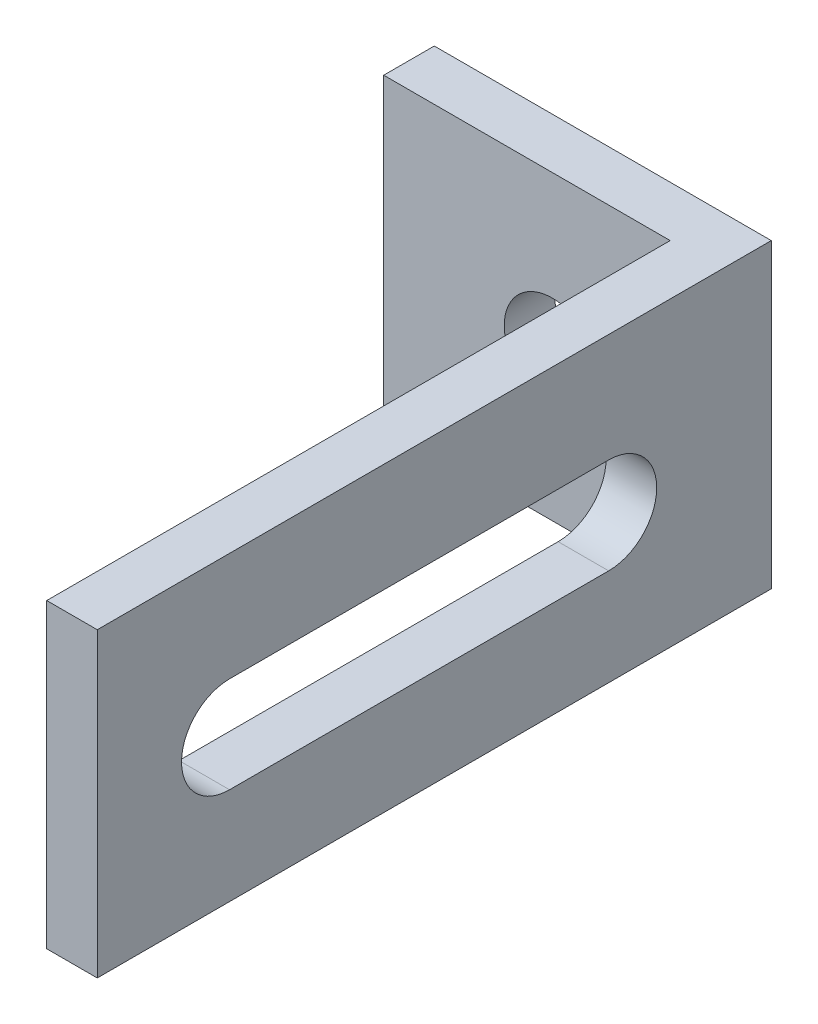
ISO-10303-21;
HEADER;
FILE_DESCRIPTION(('STEP AP214'),'2;1');
FILE_NAME('part.step','',(''),(''),'','','');
FILE_SCHEMA(('AUTOMOTIVE_DESIGN { 1 0 10303 214 1 1 1 1 }'));
ENDSEC;
DATA;
#1=APPLICATION_CONTEXT('core data for automotive mechanical design processes');
#2=APPLICATION_PROTOCOL_DEFINITION('international standard','automotive_design',2000,#1);
#3=PRODUCT_CONTEXT('',#1,'mechanical');
#4=PRODUCT('Part','Part','',(#3));
#5=PRODUCT_RELATED_PRODUCT_CATEGORY('part','',(#4));
#6=PRODUCT_DEFINITION_FORMATION('','',#4);
#7=PRODUCT_DEFINITION_CONTEXT('part definition',#1,'design');
#8=PRODUCT_DEFINITION('design','',#6,#7);
#9=PRODUCT_DEFINITION_SHAPE('','',#8);
#10=(LENGTH_UNIT() NAMED_UNIT(*) SI_UNIT(.MILLI.,.METRE.));
#11=(NAMED_UNIT(*) PLANE_ANGLE_UNIT() SI_UNIT($,.RADIAN.));
#12=(NAMED_UNIT(*) SI_UNIT($,.STERADIAN.) SOLID_ANGLE_UNIT());
#13=UNCERTAINTY_MEASURE_WITH_UNIT(LENGTH_MEASURE(1.E-05),#10,'distance_accuracy_value','');
#14=(GEOMETRIC_REPRESENTATION_CONTEXT(3) GLOBAL_UNCERTAINTY_ASSIGNED_CONTEXT((#13)) GLOBAL_UNIT_ASSIGNED_CONTEXT((#10,
#11,#12)) REPRESENTATION_CONTEXT('',''));
#15=CARTESIAN_POINT('',(0.,0.,0.));
#16=DIRECTION('',(0.,0.,1.));
#17=DIRECTION('',(1.,0.,0.));
#18=AXIS2_PLACEMENT_3D('',#15,#16,#17);
#19=CARTESIAN_POINT('',(0.,0.,3.));
#20=DIRECTION('',(0.,0.,-1.));
#21=DIRECTION('',(-1.,0.,0.));
#22=AXIS2_PLACEMENT_3D('',#19,#20,#21);
#23=PLANE('',#22);
#24=CARTESIAN_POINT('',(0.,-0.349999999999998,3.));
#25=DIRECTION('',(0.,0.,1.));
#26=DIRECTION('',(1.,0.,0.));
#27=AXIS2_PLACEMENT_3D('',#24,#25,#26);
#28=CIRCLE('',#27,2.85);
#29=CARTESIAN_POINT('',(2.85,-0.349999999999998,3.));
#30=VERTEX_POINT('',#29);
#31=EDGE_CURVE('E175',#30,#30,#28,.T.);
#32=ORIENTED_EDGE('',*,*,#31,.F.);
#33=EDGE_LOOP('',(#32));
#34=FACE_BOUND('',#33,.T.);
#35=DIRECTION('',(0.,-1.,0.));
#36=VECTOR('',#35,1.);
#37=CARTESIAN_POINT('',(7.,8.95,3.));
#38=LINE('',#37,#36);
#39=CARTESIAN_POINT('',(7.,8.95,3.));
#40=VERTEX_POINT('',#39);
#41=CARTESIAN_POINT('',(7.,-8.95,3.));
#42=VERTEX_POINT('',#41);
#43=EDGE_CURVE('E155',#40,#42,#38,.T.);
#44=ORIENTED_EDGE('',*,*,#43,.F.);
#45=DIRECTION('',(-1.,0.,0.));
#46=VECTOR('',#45,1.);
#47=CARTESIAN_POINT('',(-10.,8.95,3.));
#48=LINE('',#47,#46);
#49=CARTESIAN_POINT('',(-10.,8.95,3.));
#50=VERTEX_POINT('',#49);
#51=EDGE_CURVE('E181',#40,#50,#48,.T.);
#52=ORIENTED_EDGE('',*,*,#51,.T.);
#53=DIRECTION('',(0.,-1.,0.));
#54=VECTOR('',#53,1.);
#55=CARTESIAN_POINT('',(-10.,-8.95,3.));
#56=LINE('',#55,#54);
#57=CARTESIAN_POINT('',(-10.,-8.95,3.));
#58=VERTEX_POINT('',#57);
#59=EDGE_CURVE('E183',#50,#58,#56,.T.);
#60=ORIENTED_EDGE('',*,*,#59,.T.);
#61=DIRECTION('',(1.,0.,0.));
#62=VECTOR('',#61,1.);
#63=CARTESIAN_POINT('',(-10.,-8.95,3.));
#64=LINE('',#63,#62);
#65=EDGE_CURVE('E186',#58,#42,#64,.T.);
#66=ORIENTED_EDGE('',*,*,#65,.T.);
#67=EDGE_LOOP('',(#44,#52,#60,#66));
#68=FACE_BOUND('',#67,.T.);
#69=ADVANCED_FACE('F41',(#34,#68),#23,.F.);
#70=CARTESIAN_POINT('',(0.,0.,0.));
#71=DIRECTION('',(0.,0.,-1.));
#72=DIRECTION('',(-1.,0.,0.));
#73=AXIS2_PLACEMENT_3D('',#70,#71,#72);
#74=PLANE('',#73);
#75=DIRECTION('',(0.,1.,0.));
#76=VECTOR('',#75,1.);
#77=CARTESIAN_POINT('',(10.,-8.95,0.));
#78=LINE('',#77,#76);
#79=CARTESIAN_POINT('',(10.,-8.95,0.));
#80=VERTEX_POINT('',#79);
#81=CARTESIAN_POINT('',(10.,8.95,0.));
#82=VERTEX_POINT('',#81);
#83=EDGE_CURVE('E178',#80,#82,#78,.T.);
#84=ORIENTED_EDGE('',*,*,#83,.F.);
#85=DIRECTION('',(1.,0.,0.));
#86=VECTOR('',#85,1.);
#87=CARTESIAN_POINT('',(-10.,-8.95,0.));
#88=LINE('',#87,#86);
#89=CARTESIAN_POINT('',(-10.,-8.95,0.));
#90=VERTEX_POINT('',#89);
#91=EDGE_CURVE('E184',#90,#80,#88,.T.);
#92=ORIENTED_EDGE('',*,*,#91,.F.);
#93=DIRECTION('',(0.,-1.,0.));
#94=VECTOR('',#93,1.);
#95=CARTESIAN_POINT('',(-10.,-8.95,0.));
#96=LINE('',#95,#94);
#97=CARTESIAN_POINT('',(-10.,8.95,0.));
#98=VERTEX_POINT('',#97);
#99=EDGE_CURVE('E193',#98,#90,#96,.T.);
#100=ORIENTED_EDGE('',*,*,#99,.F.);
#101=DIRECTION('',(-1.,0.,0.));
#102=VECTOR('',#101,1.);
#103=CARTESIAN_POINT('',(-10.,8.95,0.));
#104=LINE('',#103,#102);
#105=EDGE_CURVE('E191',#82,#98,#104,.T.);
#106=ORIENTED_EDGE('',*,*,#105,.F.);
#107=EDGE_LOOP('',(#84,#92,#100,#106));
#108=FACE_BOUND('',#107,.T.);
#109=CARTESIAN_POINT('',(0.,-0.349999999999998,0.));
#110=DIRECTION('',(0.,0.,1.));
#111=DIRECTION('',(1.,0.,0.));
#112=AXIS2_PLACEMENT_3D('',#109,#110,#111);
#113=CIRCLE('',#112,2.85);
#114=CARTESIAN_POINT('',(2.85,-0.349999999999998,0.));
#115=VERTEX_POINT('',#114);
#116=EDGE_CURVE('E174',#115,#115,#113,.T.);
#117=ORIENTED_EDGE('',*,*,#116,.T.);
#118=EDGE_LOOP('',(#117));
#119=FACE_BOUND('',#118,.T.);
#120=ADVANCED_FACE('F212',(#108,#119),#74,.T.);
#121=CARTESIAN_POINT('',(10.,-8.95,3.));
#122=DIRECTION('',(-1.,0.,0.));
#123=DIRECTION('',(0.,0.,1.));
#124=AXIS2_PLACEMENT_3D('',#121,#122,#123);
#125=PLANE('',#124);
#126=DIRECTION('',(0.,0.,1.));
#127=VECTOR('',#126,1.);
#128=CARTESIAN_POINT('',(10.,-3.2,3.));
#129=LINE('',#128,#127);
#130=CARTESIAN_POINT('',(10.,-3.2,9.65));
#131=VERTEX_POINT('',#130);
#132=CARTESIAN_POINT('',(10.,-3.2,32.15));
#133=VERTEX_POINT('',#132);
#134=EDGE_CURVE('E149',#131,#133,#129,.T.);
#135=ORIENTED_EDGE('',*,*,#134,.T.);
#136=CARTESIAN_POINT('',(10.,-0.349999999999999,32.15));
#137=DIRECTION('',(-1.,0.,0.));
#138=DIRECTION('',(0.,0.,1.));
#139=AXIS2_PLACEMENT_3D('',#136,#137,#138);
#140=CIRCLE('',#139,2.85);
#141=CARTESIAN_POINT('',(10.,2.5,32.15));
#142=VERTEX_POINT('',#141);
#143=EDGE_CURVE('E152',#133,#142,#140,.T.);
#144=ORIENTED_EDGE('',*,*,#143,.T.);
#145=DIRECTION('',(0.,0.,-1.));
#146=VECTOR('',#145,1.);
#147=CARTESIAN_POINT('',(10.,2.5,3.));
#148=LINE('',#147,#146);
#149=CARTESIAN_POINT('',(10.,2.5,9.65));
#150=VERTEX_POINT('',#149);
#151=EDGE_CURVE('E144',#142,#150,#148,.T.);
#152=ORIENTED_EDGE('',*,*,#151,.T.);
#153=CARTESIAN_POINT('',(10.,-0.350000000000002,9.65));
#154=DIRECTION('',(-1.,0.,0.));
#155=DIRECTION('',(0.,0.,1.));
#156=AXIS2_PLACEMENT_3D('',#153,#154,#155);
#157=CIRCLE('',#156,2.85);
#158=EDGE_CURVE('E124',#150,#131,#157,.T.);
#159=ORIENTED_EDGE('',*,*,#158,.T.);
#160=EDGE_LOOP('',(#135,#144,#152,#159));
#161=FACE_BOUND('',#160,.T.);
#162=ORIENTED_EDGE('',*,*,#83,.T.);
#163=DIRECTION('',(0.,0.,-1.));
#164=VECTOR('',#163,1.);
#165=CARTESIAN_POINT('',(10.,8.95,3.));
#166=LINE('',#165,#164);
#167=CARTESIAN_POINT('',(10.,8.95,40.));
#168=VERTEX_POINT('',#167);
#169=EDGE_CURVE('E11',#168,#82,#166,.T.);
#170=ORIENTED_EDGE('',*,*,#169,.F.);
#171=DIRECTION('',(0.,1.,0.));
#172=VECTOR('',#171,1.);
#173=CARTESIAN_POINT('',(10.,8.95,40.));
#174=LINE('',#173,#172);
#175=CARTESIAN_POINT('',(10.,-8.95,40.));
#176=VERTEX_POINT('',#175);
#177=EDGE_CURVE('E156',#176,#168,#174,.T.);
#178=ORIENTED_EDGE('',*,*,#177,.F.);
#179=DIRECTION('',(0.,0.,-1.));
#180=VECTOR('',#179,1.);
#181=CARTESIAN_POINT('',(10.,-8.95,3.));
#182=LINE('',#181,#180);
#183=EDGE_CURVE('E188',#176,#80,#182,.T.);
#184=ORIENTED_EDGE('',*,*,#183,.T.);
#185=EDGE_LOOP('',(#162,#170,#178,#184));
#186=FACE_BOUND('',#185,.T.);
#187=ADVANCED_FACE('F43',(#161,#186),#125,.F.);
#188=CARTESIAN_POINT('',(-10.,8.95,3.));
#189=DIRECTION('',(0.,-1.,0.));
#190=DIRECTION('',(0.,0.,-1.));
#191=AXIS2_PLACEMENT_3D('',#188,#189,#190);
#192=PLANE('',#191);
#193=ORIENTED_EDGE('',*,*,#105,.T.);
#194=DIRECTION('',(0.,0.,-1.));
#195=VECTOR('',#194,1.);
#196=CARTESIAN_POINT('',(-10.,8.95,3.));
#197=LINE('',#196,#195);
#198=EDGE_CURVE('E49',#50,#98,#197,.T.);
#199=ORIENTED_EDGE('',*,*,#198,.F.);
#200=ORIENTED_EDGE('',*,*,#51,.F.);
#201=DIRECTION('',(0.,0.,-1.));
#202=VECTOR('',#201,1.);
#203=CARTESIAN_POINT('',(7.,8.95,40.));
#204=LINE('',#203,#202);
#205=CARTESIAN_POINT('',(7.,8.95,40.));
#206=VERTEX_POINT('',#205);
#207=EDGE_CURVE('E171',#206,#40,#204,.T.);
#208=ORIENTED_EDGE('',*,*,#207,.F.);
#209=DIRECTION('',(-1.,0.,0.));
#210=VECTOR('',#209,1.);
#211=CARTESIAN_POINT('',(10.,8.95,40.));
#212=LINE('',#211,#210);
#213=EDGE_CURVE('E159',#168,#206,#212,.T.);
#214=ORIENTED_EDGE('',*,*,#213,.F.);
#215=ORIENTED_EDGE('',*,*,#169,.T.);
#216=EDGE_LOOP('',(#193,#199,#200,#208,#214,#215));
#217=FACE_BOUND('',#216,.T.);
#218=ADVANCED_FACE('F227',(#217),#192,.F.);
#219=CARTESIAN_POINT('',(-10.,-8.95,3.));
#220=DIRECTION('',(1.,0.,0.));
#221=DIRECTION('',(0.,0.,-1.));
#222=AXIS2_PLACEMENT_3D('',#219,#220,#221);
#223=PLANE('',#222);
#224=ORIENTED_EDGE('',*,*,#99,.T.);
#225=DIRECTION('',(0.,0.,-1.));
#226=VECTOR('',#225,1.);
#227=CARTESIAN_POINT('',(-10.,-8.95,3.));
#228=LINE('',#227,#226);
#229=EDGE_CURVE('E198',#58,#90,#228,.T.);
#230=ORIENTED_EDGE('',*,*,#229,.F.);
#231=ORIENTED_EDGE('',*,*,#59,.F.);
#232=ORIENTED_EDGE('',*,*,#198,.T.);
#233=EDGE_LOOP('',(#224,#230,#231,#232));
#234=FACE_BOUND('',#233,.T.);
#235=ADVANCED_FACE('F205',(#234),#223,.F.);
#236=CARTESIAN_POINT('',(-10.,-8.95,3.));
#237=DIRECTION('',(0.,1.,0.));
#238=DIRECTION('',(0.,0.,1.));
#239=AXIS2_PLACEMENT_3D('',#236,#237,#238);
#240=PLANE('',#239);
#241=ORIENTED_EDGE('',*,*,#91,.T.);
#242=ORIENTED_EDGE('',*,*,#183,.F.);
#243=DIRECTION('',(1.,0.,0.));
#244=VECTOR('',#243,1.);
#245=CARTESIAN_POINT('',(10.,-8.95,40.));
#246=LINE('',#245,#244);
#247=CARTESIAN_POINT('',(7.,-8.95,40.));
#248=VERTEX_POINT('',#247);
#249=EDGE_CURVE('E163',#248,#176,#246,.T.);
#250=ORIENTED_EDGE('',*,*,#249,.F.);
#251=DIRECTION('',(0.,0.,-1.));
#252=VECTOR('',#251,1.);
#253=CARTESIAN_POINT('',(7.,-8.95,40.));
#254=LINE('',#253,#252);
#255=EDGE_CURVE('E166',#248,#42,#254,.T.);
#256=ORIENTED_EDGE('',*,*,#255,.T.);
#257=ORIENTED_EDGE('',*,*,#65,.F.);
#258=ORIENTED_EDGE('',*,*,#229,.T.);
#259=EDGE_LOOP('',(#241,#242,#250,#256,#257,#258));
#260=FACE_BOUND('',#259,.T.);
#261=ADVANCED_FACE('F215',(#260),#240,.F.);
#262=CARTESIAN_POINT('',(0.,-0.349999999999998,3.));
#263=DIRECTION('',(0.,0.,-1.));
#264=DIRECTION('',(-1.,0.,0.));
#265=AXIS2_PLACEMENT_3D('',#262,#263,#264);
#266=CYLINDRICAL_SURFACE('',#265,2.85);
#267=ORIENTED_EDGE('',*,*,#31,.T.);
#268=EDGE_LOOP('',(#267));
#269=FACE_BOUND('',#268,.T.);
#270=ORIENTED_EDGE('',*,*,#116,.F.);
#271=EDGE_LOOP('',(#270));
#272=FACE_BOUND('',#271,.T.);
#273=ADVANCED_FACE('F246',(#269,#272),#266,.F.);
#274=CARTESIAN_POINT('',(7.,8.95,40.));
#275=DIRECTION('',(1.,0.,0.));
#276=DIRECTION('',(0.,1.,0.));
#277=AXIS2_PLACEMENT_3D('',#274,#275,#276);
#278=PLANE('',#277);
#279=DIRECTION('',(0.,0.,-1.));
#280=VECTOR('',#279,1.);
#281=CARTESIAN_POINT('',(7.,2.5,32.15));
#282=LINE('',#281,#280);
#283=CARTESIAN_POINT('',(7.,2.5,32.15));
#284=VERTEX_POINT('',#283);
#285=CARTESIAN_POINT('',(7.,2.5,9.65));
#286=VERTEX_POINT('',#285);
#287=EDGE_CURVE('E130',#284,#286,#282,.T.);
#288=ORIENTED_EDGE('',*,*,#287,.F.);
#289=CARTESIAN_POINT('',(7.,-0.35,32.15));
#290=DIRECTION('',(-1.,0.,0.));
#291=DIRECTION('',(0.,-1.,0.));
#292=AXIS2_PLACEMENT_3D('',#289,#290,#291);
#293=CIRCLE('',#292,2.85);
#294=CARTESIAN_POINT('',(7.,-3.2,32.15));
#295=VERTEX_POINT('',#294);
#296=EDGE_CURVE('E64',#295,#284,#293,.T.);
#297=ORIENTED_EDGE('',*,*,#296,.F.);
#298=DIRECTION('',(0.,0.,1.));
#299=VECTOR('',#298,1.);
#300=CARTESIAN_POINT('',(7.,-3.2,32.15));
#301=LINE('',#300,#299);
#302=CARTESIAN_POINT('',(7.,-3.2,9.65));
#303=VERTEX_POINT('',#302);
#304=EDGE_CURVE('E137',#303,#295,#301,.T.);
#305=ORIENTED_EDGE('',*,*,#304,.F.);
#306=CARTESIAN_POINT('',(7.,-0.350000000000002,9.65));
#307=DIRECTION('',(-1.,0.,0.));
#308=DIRECTION('',(0.,-1.,0.));
#309=AXIS2_PLACEMENT_3D('',#306,#307,#308);
#310=CIRCLE('',#309,2.85);
#311=EDGE_CURVE('E121',#286,#303,#310,.T.);
#312=ORIENTED_EDGE('',*,*,#311,.F.);
#313=EDGE_LOOP('',(#288,#297,#305,#312));
#314=FACE_BOUND('',#313,.T.);
#315=ORIENTED_EDGE('',*,*,#43,.T.);
#316=ORIENTED_EDGE('',*,*,#255,.F.);
#317=DIRECTION('',(0.,-1.,0.));
#318=VECTOR('',#317,1.);
#319=CARTESIAN_POINT('',(7.,8.95,40.));
#320=LINE('',#319,#318);
#321=EDGE_CURVE('E161',#206,#248,#320,.T.);
#322=ORIENTED_EDGE('',*,*,#321,.F.);
#323=ORIENTED_EDGE('',*,*,#207,.T.);
#324=EDGE_LOOP('',(#315,#316,#322,#323));
#325=FACE_BOUND('',#324,.T.);
#326=ADVANCED_FACE('F134',(#314,#325),#278,.F.);
#327=CARTESIAN_POINT('',(0.,0.,40.));
#328=DIRECTION('',(0.,0.,-1.));
#329=DIRECTION('',(-1.,0.,0.));
#330=AXIS2_PLACEMENT_3D('',#327,#328,#329);
#331=PLANE('',#330);
#332=ORIENTED_EDGE('',*,*,#177,.T.);
#333=ORIENTED_EDGE('',*,*,#213,.T.);
#334=ORIENTED_EDGE('',*,*,#321,.T.);
#335=ORIENTED_EDGE('',*,*,#249,.T.);
#336=EDGE_LOOP('',(#332,#333,#334,#335));
#337=FACE_BOUND('',#336,.T.);
#338=ADVANCED_FACE('F222',(#337),#331,.F.);
#339=CARTESIAN_POINT('',(44.,-0.349999999999991,32.15));
#340=DIRECTION('',(-1.,0.,0.));
#341=DIRECTION('',(0.,-1.,0.));
#342=AXIS2_PLACEMENT_3D('',#339,#340,#341);
#343=CYLINDRICAL_SURFACE('',#342,2.85);
#344=DIRECTION('',(-1.,0.,0.));
#345=VECTOR('',#344,1.);
#346=CARTESIAN_POINT('',(44.,-3.19999999999999,32.15));
#347=LINE('',#346,#345);
#348=EDGE_CURVE('E142',#133,#295,#347,.T.);
#349=ORIENTED_EDGE('',*,*,#348,.T.);
#350=ORIENTED_EDGE('',*,*,#296,.T.);
#351=DIRECTION('',(-1.,0.,0.));
#352=VECTOR('',#351,1.);
#353=CARTESIAN_POINT('',(44.,2.50000000000001,32.15));
#354=LINE('',#353,#352);
#355=EDGE_CURVE('E127',#142,#284,#354,.T.);
#356=ORIENTED_EDGE('',*,*,#355,.F.);
#357=ORIENTED_EDGE('',*,*,#143,.F.);
#358=EDGE_LOOP('',(#349,#350,#356,#357));
#359=FACE_BOUND('',#358,.T.);
#360=ADVANCED_FACE('F261',(#359),#343,.F.);
#361=CARTESIAN_POINT('',(44.,-3.19999999999999,32.15));
#362=DIRECTION('',(0.,-1.,0.));
#363=DIRECTION('',(1.,0.,0.));
#364=AXIS2_PLACEMENT_3D('',#361,#362,#363);
#365=PLANE('',#364);
#366=DIRECTION('',(-1.,0.,0.));
#367=VECTOR('',#366,1.);
#368=CARTESIAN_POINT('',(44.,-3.19999999999999,9.65));
#369=LINE('',#368,#367);
#370=EDGE_CURVE('E126',#131,#303,#369,.T.);
#371=ORIENTED_EDGE('',*,*,#370,.T.);
#372=ORIENTED_EDGE('',*,*,#304,.T.);
#373=ORIENTED_EDGE('',*,*,#348,.F.);
#374=ORIENTED_EDGE('',*,*,#134,.F.);
#375=EDGE_LOOP('',(#371,#372,#373,#374));
#376=FACE_BOUND('',#375,.T.);
#377=ADVANCED_FACE('F265',(#376),#365,.F.);
#378=CARTESIAN_POINT('',(44.,-0.349999999999993,9.65));
#379=DIRECTION('',(-1.,0.,0.));
#380=DIRECTION('',(0.,-1.,0.));
#381=AXIS2_PLACEMENT_3D('',#378,#379,#380);
#382=CYLINDRICAL_SURFACE('',#381,2.85);
#383=DIRECTION('',(-1.,0.,0.));
#384=VECTOR('',#383,1.);
#385=CARTESIAN_POINT('',(44.,2.50000000000001,9.65));
#386=LINE('',#385,#384);
#387=EDGE_CURVE('E56',#150,#286,#386,.T.);
#388=ORIENTED_EDGE('',*,*,#387,.T.);
#389=ORIENTED_EDGE('',*,*,#311,.T.);
#390=ORIENTED_EDGE('',*,*,#370,.F.);
#391=ORIENTED_EDGE('',*,*,#158,.F.);
#392=EDGE_LOOP('',(#388,#389,#390,#391));
#393=FACE_BOUND('',#392,.T.);
#394=ADVANCED_FACE('F118',(#393),#382,.F.);
#395=CARTESIAN_POINT('',(44.,2.50000000000001,32.15));
#396=DIRECTION('',(0.,1.,0.));
#397=DIRECTION('',(-1.,0.,0.));
#398=AXIS2_PLACEMENT_3D('',#395,#396,#397);
#399=PLANE('',#398);
#400=ORIENTED_EDGE('',*,*,#355,.T.);
#401=ORIENTED_EDGE('',*,*,#287,.T.);
#402=ORIENTED_EDGE('',*,*,#387,.F.);
#403=ORIENTED_EDGE('',*,*,#151,.F.);
#404=EDGE_LOOP('',(#400,#401,#402,#403));
#405=FACE_BOUND('',#404,.T.);
#406=ADVANCED_FACE('F131',(#405),#399,.F.);
#407=CLOSED_SHELL('',(#69,#120,#187,#218,#235,#261,#273,#326,#338,#360,#377,#394,#406));
#408=MANIFOLD_SOLID_BREP('B2',#407);
#409=ADVANCED_BREP_SHAPE_REPRESENTATION('',(#18,#408),#14);
#410=SHAPE_DEFINITION_REPRESENTATION(#9,#409);
ENDSEC;
END-ISO-10303-21;
